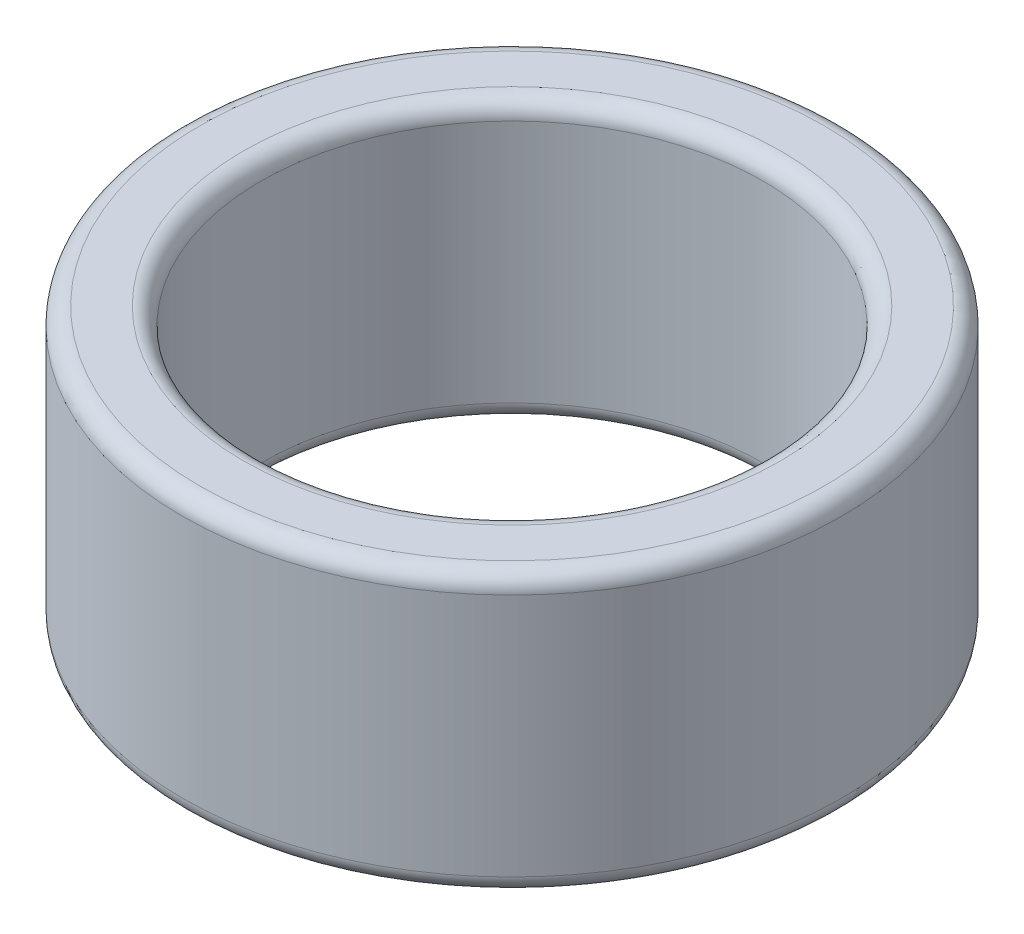
ISO-10303-21;
HEADER;
FILE_DESCRIPTION(('STEP AP214'),'2;1');
FILE_NAME('part.step','',(''),(''),'','','');
FILE_SCHEMA(('AUTOMOTIVE_DESIGN { 1 0 10303 214 1 1 1 1 }'));
ENDSEC;
DATA;
#1=APPLICATION_CONTEXT('core data for automotive mechanical design processes');
#2=APPLICATION_PROTOCOL_DEFINITION('international standard','automotive_design',2000,#1);
#3=PRODUCT_CONTEXT('',#1,'mechanical');
#4=PRODUCT('Part','Part','',(#3));
#5=PRODUCT_RELATED_PRODUCT_CATEGORY('part','',(#4));
#6=PRODUCT_DEFINITION_FORMATION('','',#4);
#7=PRODUCT_DEFINITION_CONTEXT('part definition',#1,'design');
#8=PRODUCT_DEFINITION('design','',#6,#7);
#9=PRODUCT_DEFINITION_SHAPE('','',#8);
#10=(LENGTH_UNIT() NAMED_UNIT(*) SI_UNIT(.MILLI.,.METRE.));
#11=(NAMED_UNIT(*) PLANE_ANGLE_UNIT() SI_UNIT($,.RADIAN.));
#12=(NAMED_UNIT(*) SI_UNIT($,.STERADIAN.) SOLID_ANGLE_UNIT());
#13=UNCERTAINTY_MEASURE_WITH_UNIT(LENGTH_MEASURE(1.E-05),#10,'distance_accuracy_value','');
#14=(GEOMETRIC_REPRESENTATION_CONTEXT(3) GLOBAL_UNCERTAINTY_ASSIGNED_CONTEXT((#13)) GLOBAL_UNIT_ASSIGNED_CONTEXT((#10,
#11,#12)) REPRESENTATION_CONTEXT('',''));
#15=CARTESIAN_POINT('',(0.,0.,0.));
#16=DIRECTION('',(0.,0.,1.));
#17=DIRECTION('',(1.,0.,0.));
#18=AXIS2_PLACEMENT_3D('',#15,#16,#17);
#19=CARTESIAN_POINT('',(0.,8.,0.));
#20=DIRECTION('',(0.,1.,0.));
#21=DIRECTION('',(0.,0.,1.));
#22=AXIS2_PLACEMENT_3D('',#19,#20,#21);
#23=PLANE('',#22);
#24=CARTESIAN_POINT('',(0.,8.,0.));
#25=DIRECTION('',(0.,1.,0.));
#26=DIRECTION('',(0.,0.,1.));
#27=AXIS2_PLACEMENT_3D('',#24,#25,#26);
#28=CIRCLE('',#27,8.95);
#29=CARTESIAN_POINT('',(0.,8.,8.95));
#30=VERTEX_POINT('',#29);
#31=EDGE_CURVE('E42',#30,#30,#28,.T.);
#32=ORIENTED_EDGE('',*,*,#31,.T.);
#33=EDGE_LOOP('',(#32));
#34=FACE_BOUND('',#33,.T.);
#35=CARTESIAN_POINT('',(0.,8.,0.));
#36=DIRECTION('',(0.,1.,0.));
#37=DIRECTION('',(0.,0.,1.));
#38=AXIS2_PLACEMENT_3D('',#35,#36,#37);
#39=CIRCLE('',#38,7.7);
#40=CARTESIAN_POINT('',(0.,8.,7.7));
#41=VERTEX_POINT('',#40);
#42=EDGE_CURVE('E46',#41,#41,#39,.F.);
#43=ORIENTED_EDGE('',*,*,#42,.T.);
#44=EDGE_LOOP('',(#43));
#45=FACE_BOUND('',#44,.T.);
#46=ADVANCED_FACE('F31',(#34,#45),#23,.T.);
#47=CARTESIAN_POINT('',(0.,0.,0.));
#48=DIRECTION('',(0.,1.,0.));
#49=DIRECTION('',(0.,0.,1.));
#50=AXIS2_PLACEMENT_3D('',#47,#48,#49);
#51=PLANE('',#50);
#52=CARTESIAN_POINT('',(0.,0.,0.));
#53=DIRECTION('',(0.,1.,0.));
#54=DIRECTION('',(0.,0.,1.));
#55=AXIS2_PLACEMENT_3D('',#52,#53,#54);
#56=CIRCLE('',#55,8.95);
#57=CARTESIAN_POINT('',(0.,0.,8.95));
#58=VERTEX_POINT('',#57);
#59=EDGE_CURVE('E51',#58,#58,#56,.F.);
#60=ORIENTED_EDGE('',*,*,#59,.T.);
#61=EDGE_LOOP('',(#60));
#62=FACE_BOUND('',#61,.T.);
#63=CARTESIAN_POINT('',(0.,0.,0.));
#64=DIRECTION('',(0.,1.,0.));
#65=DIRECTION('',(0.,0.,1.));
#66=AXIS2_PLACEMENT_3D('',#63,#64,#65);
#67=CIRCLE('',#66,7.7);
#68=CARTESIAN_POINT('',(0.,0.,7.7));
#69=VERTEX_POINT('',#68);
#70=EDGE_CURVE('E54',#69,#69,#67,.T.);
#71=ORIENTED_EDGE('',*,*,#70,.T.);
#72=EDGE_LOOP('',(#71));
#73=FACE_BOUND('',#72,.T.);
#74=ADVANCED_FACE('F76',(#62,#73),#51,.F.);
#75=CARTESIAN_POINT('',(0.,8.,0.));
#76=DIRECTION('',(0.,-1.,0.));
#77=DIRECTION('',(0.,0.,-1.));
#78=AXIS2_PLACEMENT_3D('',#75,#76,#77);
#79=CYLINDRICAL_SURFACE('',#78,9.45);
#80=CARTESIAN_POINT('',(0.,0.5,0.));
#81=DIRECTION('',(0.,1.,0.));
#82=DIRECTION('',(0.,0.,1.));
#83=AXIS2_PLACEMENT_3D('',#80,#81,#82);
#84=CIRCLE('',#83,9.45);
#85=CARTESIAN_POINT('',(0.,0.5,9.45));
#86=VERTEX_POINT('',#85);
#87=EDGE_CURVE('E57',#86,#86,#84,.T.);
#88=ORIENTED_EDGE('',*,*,#87,.T.);
#89=EDGE_LOOP('',(#88));
#90=FACE_BOUND('',#89,.T.);
#91=CARTESIAN_POINT('',(0.,7.5,0.));
#92=DIRECTION('',(0.,1.,0.));
#93=DIRECTION('',(0.,0.,1.));
#94=AXIS2_PLACEMENT_3D('',#91,#92,#93);
#95=CIRCLE('',#94,9.45);
#96=CARTESIAN_POINT('',(0.,7.5,9.45));
#97=VERTEX_POINT('',#96);
#98=EDGE_CURVE('E60',#97,#97,#95,.F.);
#99=ORIENTED_EDGE('',*,*,#98,.T.);
#100=EDGE_LOOP('',(#99));
#101=FACE_BOUND('',#100,.T.);
#102=ADVANCED_FACE('F64',(#90,#101),#79,.T.);
#103=CARTESIAN_POINT('',(0.,8.,0.));
#104=DIRECTION('',(0.,-1.,0.));
#105=DIRECTION('',(0.,0.,-1.));
#106=AXIS2_PLACEMENT_3D('',#103,#104,#105);
#107=CYLINDRICAL_SURFACE('',#106,7.2);
#108=CARTESIAN_POINT('',(0.,0.5,0.));
#109=DIRECTION('',(0.,1.,0.));
#110=DIRECTION('',(0.,0.,1.));
#111=AXIS2_PLACEMENT_3D('',#108,#109,#110);
#112=CIRCLE('',#111,7.2);
#113=CARTESIAN_POINT('',(0.,0.5,7.2));
#114=VERTEX_POINT('',#113);
#115=EDGE_CURVE('E10',#114,#114,#112,.F.);
#116=ORIENTED_EDGE('',*,*,#115,.T.);
#117=EDGE_LOOP('',(#116));
#118=FACE_BOUND('',#117,.T.);
#119=CARTESIAN_POINT('',(0.,7.5,0.));
#120=DIRECTION('',(0.,1.,0.));
#121=DIRECTION('',(0.,0.,1.));
#122=AXIS2_PLACEMENT_3D('',#119,#120,#121);
#123=CIRCLE('',#122,7.2);
#124=CARTESIAN_POINT('',(0.,7.5,7.2));
#125=VERTEX_POINT('',#124);
#126=EDGE_CURVE('E38',#125,#125,#123,.T.);
#127=ORIENTED_EDGE('',*,*,#126,.T.);
#128=EDGE_LOOP('',(#127));
#129=FACE_BOUND('',#128,.T.);
#130=ADVANCED_FACE('F92',(#118,#129),#107,.F.);
#131=CARTESIAN_POINT('',(0.,0.5,0.));
#132=DIRECTION('',(0.,1.,0.));
#133=DIRECTION('',(0.,0.,1.));
#134=AXIS2_PLACEMENT_3D('',#131,#132,#133);
#135=TOROIDAL_SURFACE('',#134,8.95,0.5);
#136=ORIENTED_EDGE('',*,*,#59,.F.);
#137=EDGE_LOOP('',(#136));
#138=FACE_BOUND('',#137,.T.);
#139=ORIENTED_EDGE('',*,*,#87,.F.);
#140=EDGE_LOOP('',(#139));
#141=FACE_BOUND('',#140,.T.);
#142=ADVANCED_FACE('F70',(#138,#141),#135,.T.);
#143=CARTESIAN_POINT('',(0.,7.5,0.));
#144=DIRECTION('',(0.,1.,0.));
#145=DIRECTION('',(0.,0.,1.));
#146=AXIS2_PLACEMENT_3D('',#143,#144,#145);
#147=TOROIDAL_SURFACE('',#146,8.95,0.5);
#148=ORIENTED_EDGE('',*,*,#98,.F.);
#149=EDGE_LOOP('',(#148));
#150=FACE_BOUND('',#149,.T.);
#151=ORIENTED_EDGE('',*,*,#31,.F.);
#152=EDGE_LOOP('',(#151));
#153=FACE_BOUND('',#152,.T.);
#154=ADVANCED_FACE('F66',(#150,#153),#147,.T.);
#155=CARTESIAN_POINT('',(0.,0.5,0.));
#156=DIRECTION('',(0.,1.,0.));
#157=DIRECTION('',(0.,0.,1.));
#158=AXIS2_PLACEMENT_3D('',#155,#156,#157);
#159=TOROIDAL_SURFACE('',#158,7.7,0.5);
#160=ORIENTED_EDGE('',*,*,#115,.F.);
#161=EDGE_LOOP('',(#160));
#162=FACE_BOUND('',#161,.T.);
#163=ORIENTED_EDGE('',*,*,#70,.F.);
#164=EDGE_LOOP('',(#163));
#165=FACE_BOUND('',#164,.T.);
#166=ADVANCED_FACE('F69',(#162,#165),#159,.T.);
#167=CARTESIAN_POINT('',(0.,7.5,0.));
#168=DIRECTION('',(0.,1.,0.));
#169=DIRECTION('',(0.,0.,1.));
#170=AXIS2_PLACEMENT_3D('',#167,#168,#169);
#171=TOROIDAL_SURFACE('',#170,7.7,0.5);
#172=ORIENTED_EDGE('',*,*,#42,.F.);
#173=EDGE_LOOP('',(#172));
#174=FACE_BOUND('',#173,.T.);
#175=ORIENTED_EDGE('',*,*,#126,.F.);
#176=EDGE_LOOP('',(#175));
#177=FACE_BOUND('',#176,.T.);
#178=ADVANCED_FACE('F33',(#174,#177),#171,.T.);
#179=CLOSED_SHELL('',(#46,#74,#102,#130,#142,#154,#166,#178));
#180=MANIFOLD_SOLID_BREP('B2',#179);
#181=ADVANCED_BREP_SHAPE_REPRESENTATION('',(#18,#180),#14);
#182=SHAPE_DEFINITION_REPRESENTATION(#9,#181);
ENDSEC;
END-ISO-10303-21;
